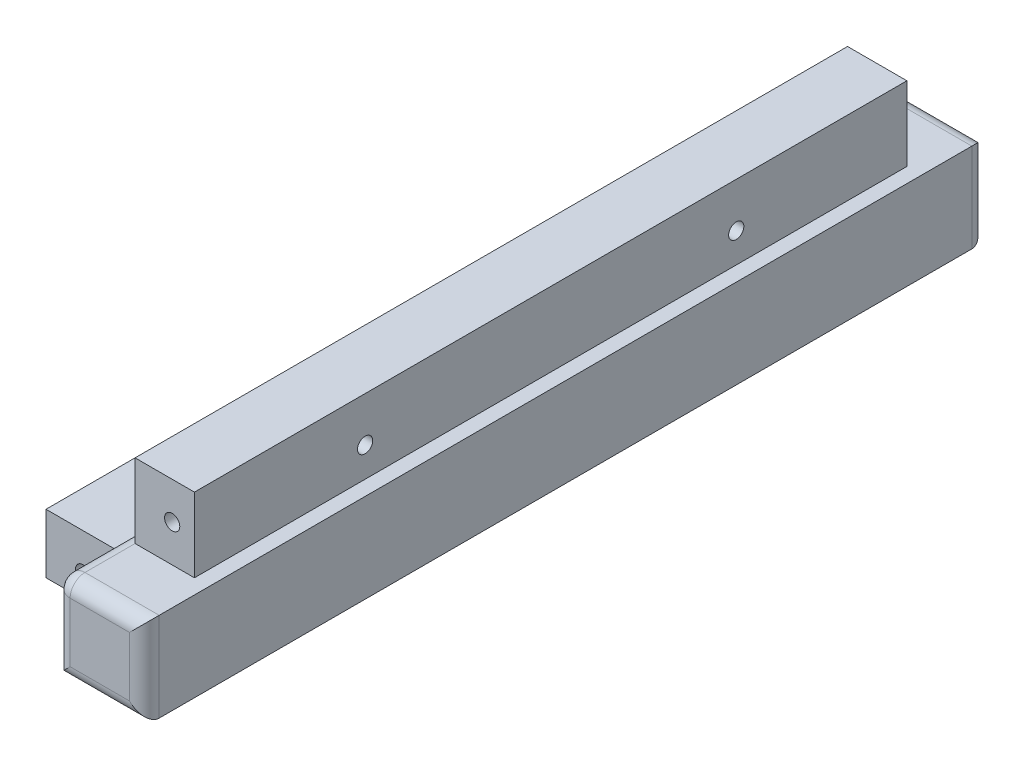
ISO-10303-21;
HEADER;
FILE_DESCRIPTION(('STEP AP214'),'2;1');
FILE_NAME('part.step','',(''),(''),'','','');
FILE_SCHEMA(('AUTOMOTIVE_DESIGN { 1 0 10303 214 1 1 1 1 }'));
ENDSEC;
DATA;
#1=APPLICATION_CONTEXT('core data for automotive mechanical design processes');
#2=APPLICATION_PROTOCOL_DEFINITION('international standard','automotive_design',2000,#1);
#3=PRODUCT_CONTEXT('',#1,'mechanical');
#4=PRODUCT('Part','Part','',(#3));
#5=PRODUCT_RELATED_PRODUCT_CATEGORY('part','',(#4));
#6=PRODUCT_DEFINITION_FORMATION('','',#4);
#7=PRODUCT_DEFINITION_CONTEXT('part definition',#1,'design');
#8=PRODUCT_DEFINITION('design','',#6,#7);
#9=PRODUCT_DEFINITION_SHAPE('','',#8);
#10=(LENGTH_UNIT() NAMED_UNIT(*) SI_UNIT(.MILLI.,.METRE.));
#11=(NAMED_UNIT(*) PLANE_ANGLE_UNIT() SI_UNIT($,.RADIAN.));
#12=(NAMED_UNIT(*) SI_UNIT($,.STERADIAN.) SOLID_ANGLE_UNIT());
#13=UNCERTAINTY_MEASURE_WITH_UNIT(LENGTH_MEASURE(1.E-05),#10,'distance_accuracy_value','');
#14=(GEOMETRIC_REPRESENTATION_CONTEXT(3) GLOBAL_UNCERTAINTY_ASSIGNED_CONTEXT((#13)) GLOBAL_UNIT_ASSIGNED_CONTEXT((#10,
#11,#12)) REPRESENTATION_CONTEXT('',''));
#15=CARTESIAN_POINT('',(0.,0.,0.));
#16=DIRECTION('',(0.,0.,1.));
#17=DIRECTION('',(1.,0.,0.));
#18=AXIS2_PLACEMENT_3D('',#15,#16,#17);
#19=CARTESIAN_POINT('',(-6.,6.,56.75));
#20=DIRECTION('',(0.,-1.,0.));
#21=DIRECTION('',(0.,0.,-1.));
#22=AXIS2_PLACEMENT_3D('',#19,#20,#21);
#23=PLANE('',#22);
#24=DIRECTION('',(1.,0.,0.));
#25=VECTOR('',#24,1.);
#26=CARTESIAN_POINT('',(4.,6.,48.));
#27=LINE('',#26,#25);
#28=CARTESIAN_POINT('',(-4.,6.,48.));
#29=VERTEX_POINT('',#28);
#30=CARTESIAN_POINT('',(4.,6.,48.));
#31=VERTEX_POINT('',#30);
#32=EDGE_CURVE('E280',#29,#31,#27,.T.);
#33=ORIENTED_EDGE('',*,*,#32,.F.);
#34=DIRECTION('',(0.,0.,-1.));
#35=VECTOR('',#34,1.);
#36=CARTESIAN_POINT('',(-4.,6.,56.75));
#37=LINE('',#36,#35);
#38=CARTESIAN_POINT('',(-4.,6.,54.75));
#39=VERTEX_POINT('',#38);
#40=EDGE_CURVE('E364',#29,#39,#37,.F.);
#41=ORIENTED_EDGE('',*,*,#40,.T.);
#42=DIRECTION('',(-1.,0.,0.));
#43=VECTOR('',#42,1.);
#44=CARTESIAN_POINT('',(6.,6.,54.75));
#45=LINE('',#44,#43);
#46=CARTESIAN_POINT('',(6.,6.,54.75));
#47=VERTEX_POINT('',#46);
#48=EDGE_CURVE('E368',#39,#47,#45,.F.);
#49=ORIENTED_EDGE('',*,*,#48,.T.);
#50=DIRECTION('',(0.,0.,-1.));
#51=VECTOR('',#50,1.);
#52=CARTESIAN_POINT('',(6.,6.,56.75));
#53=LINE('',#52,#51);
#54=CARTESIAN_POINT('',(6.,6.,-54.75));
#55=VERTEX_POINT('',#54);
#56=EDGE_CURVE('E360',#47,#55,#53,.T.);
#57=ORIENTED_EDGE('',*,*,#56,.T.);
#58=DIRECTION('',(-1.,0.,0.));
#59=VECTOR('',#58,1.);
#60=CARTESIAN_POINT('',(-6.,6.,-54.75));
#61=LINE('',#60,#59);
#62=CARTESIAN_POINT('',(-4.,6.,-54.75));
#63=VERTEX_POINT('',#62);
#64=EDGE_CURVE('E371',#55,#63,#61,.T.);
#65=ORIENTED_EDGE('',*,*,#64,.T.);
#66=CARTESIAN_POINT('',(-4.,6.,-48.));
#67=VERTEX_POINT('',#66);
#68=EDGE_CURVE('E365',#63,#67,#37,.F.);
#69=ORIENTED_EDGE('',*,*,#68,.T.);
#70=DIRECTION('',(-1.,0.,0.));
#71=VECTOR('',#70,1.);
#72=CARTESIAN_POINT('',(4.,6.,-48.));
#73=LINE('',#72,#71);
#74=CARTESIAN_POINT('',(4.,6.,-48.));
#75=VERTEX_POINT('',#74);
#76=EDGE_CURVE('E74',#75,#67,#73,.T.);
#77=ORIENTED_EDGE('',*,*,#76,.F.);
#78=DIRECTION('',(0.,0.,1.));
#79=VECTOR('',#78,1.);
#80=CARTESIAN_POINT('',(4.,6.,-69.5562484748662));
#81=LINE('',#80,#79);
#82=EDGE_CURVE('E69',#75,#31,#81,.T.);
#83=ORIENTED_EDGE('',*,*,#82,.T.);
#84=EDGE_LOOP('',(#33,#41,#49,#57,#65,#69,#77,#83));
#85=FACE_BOUND('',#84,.T.);
#86=ADVANCED_FACE('F51',(#85),#23,.F.);
#87=CARTESIAN_POINT('',(-6.,6.,56.75));
#88=DIRECTION('',(1.,0.,0.));
#89=DIRECTION('',(0.,1.,0.));
#90=AXIS2_PLACEMENT_3D('',#87,#88,#89);
#91=PLANE('',#90);
#92=DIRECTION('',(0.,1.,0.));
#93=VECTOR('',#92,1.);
#94=CARTESIAN_POINT('',(-6.,4.00000000000034,48.));
#95=LINE('',#94,#93);
#96=CARTESIAN_POINT('',(-6.,-3.99999999999965,48.));
#97=VERTEX_POINT('',#96);
#98=CARTESIAN_POINT('',(-6.,4.,48.));
#99=VERTEX_POINT('',#98);
#100=EDGE_CURVE('E285',#97,#99,#95,.T.);
#101=ORIENTED_EDGE('',*,*,#100,.F.);
#102=DIRECTION('',(0.,0.,1.));
#103=VECTOR('',#102,1.);
#104=CARTESIAN_POINT('',(-5.99999999999973,-3.99999999999965,-69.5562484748662));
#105=LINE('',#104,#103);
#106=CARTESIAN_POINT('',(-6.,-4.,-48.));
#107=VERTEX_POINT('',#106);
#108=EDGE_CURVE('E325',#107,#97,#105,.T.);
#109=ORIENTED_EDGE('',*,*,#108,.F.);
#110=DIRECTION('',(0.,-1.,0.));
#111=VECTOR('',#110,1.);
#112=CARTESIAN_POINT('',(-6.,4.00000000000034,-48.));
#113=LINE('',#112,#111);
#114=CARTESIAN_POINT('',(-6.,4.00000000000034,-48.));
#115=VERTEX_POINT('',#114);
#116=EDGE_CURVE('E314',#115,#107,#113,.T.);
#117=ORIENTED_EDGE('',*,*,#116,.F.);
#118=DIRECTION('',(0.,0.,-1.));
#119=VECTOR('',#118,1.);
#120=CARTESIAN_POINT('',(-6.,4.,56.75));
#121=LINE('',#120,#119);
#122=CARTESIAN_POINT('',(-6.,4.,-54.75));
#123=VERTEX_POINT('',#122);
#124=EDGE_CURVE('E388',#115,#123,#121,.T.);
#125=ORIENTED_EDGE('',*,*,#124,.T.);
#126=DIRECTION('',(0.,-1.,0.));
#127=VECTOR('',#126,1.);
#128=CARTESIAN_POINT('',(-6.,6.,-54.75));
#129=LINE('',#128,#127);
#130=CARTESIAN_POINT('',(-6.,-6.,-54.75));
#131=VERTEX_POINT('',#130);
#132=EDGE_CURVE('E396',#123,#131,#129,.T.);
#133=ORIENTED_EDGE('',*,*,#132,.T.);
#134=DIRECTION('',(0.,0.,-1.));
#135=VECTOR('',#134,1.);
#136=CARTESIAN_POINT('',(-6.,-6.,56.75));
#137=LINE('',#136,#135);
#138=CARTESIAN_POINT('',(-6.,-6.,54.75));
#139=VERTEX_POINT('',#138);
#140=EDGE_CURVE('E356',#139,#131,#137,.T.);
#141=ORIENTED_EDGE('',*,*,#140,.F.);
#142=DIRECTION('',(0.,-1.,0.));
#143=VECTOR('',#142,1.);
#144=CARTESIAN_POINT('',(-6.,6.,54.75));
#145=LINE('',#144,#143);
#146=CARTESIAN_POINT('',(-6.,4.,54.75));
#147=VERTEX_POINT('',#146);
#148=EDGE_CURVE('E393',#139,#147,#145,.F.);
#149=ORIENTED_EDGE('',*,*,#148,.T.);
#150=EDGE_CURVE('E389',#147,#99,#121,.T.);
#151=ORIENTED_EDGE('',*,*,#150,.T.);
#152=EDGE_LOOP('',(#101,#109,#117,#125,#133,#141,#149,#151));
#153=FACE_BOUND('',#152,.T.);
#154=ADVANCED_FACE('F490',(#153),#91,.F.);
#155=CARTESIAN_POINT('',(6.,6.,56.75));
#156=DIRECTION('',(-1.,0.,0.));
#157=DIRECTION('',(0.,-1.,0.));
#158=AXIS2_PLACEMENT_3D('',#155,#156,#157);
#159=PLANE('',#158);
#160=DIRECTION('',(0.,0.,-1.));
#161=VECTOR('',#160,1.);
#162=CARTESIAN_POINT('',(6.,-6.,56.75));
#163=LINE('',#162,#161);
#164=CARTESIAN_POINT('',(6.,-6.,54.75));
#165=VERTEX_POINT('',#164);
#166=CARTESIAN_POINT('',(6.,-6.,-54.75));
#167=VERTEX_POINT('',#166);
#168=EDGE_CURVE('E352',#165,#167,#163,.T.);
#169=ORIENTED_EDGE('',*,*,#168,.T.);
#170=DIRECTION('',(0.,1.,0.));
#171=VECTOR('',#170,1.);
#172=CARTESIAN_POINT('',(6.,6.,-54.75));
#173=LINE('',#172,#171);
#174=EDGE_CURVE('E408',#167,#55,#173,.T.);
#175=ORIENTED_EDGE('',*,*,#174,.T.);
#176=ORIENTED_EDGE('',*,*,#56,.F.);
#177=DIRECTION('',(0.,1.,0.));
#178=VECTOR('',#177,1.);
#179=CARTESIAN_POINT('',(6.,-6.,54.75));
#180=LINE('',#179,#178);
#181=EDGE_CURVE('E405',#47,#165,#180,.F.);
#182=ORIENTED_EDGE('',*,*,#181,.T.);
#183=EDGE_LOOP('',(#169,#175,#176,#182));
#184=FACE_BOUND('',#183,.T.);
#185=ADVANCED_FACE('F527',(#184),#159,.F.);
#186=CARTESIAN_POINT('',(-6.,-6.,56.75));
#187=DIRECTION('',(0.,1.,0.));
#188=DIRECTION('',(0.,0.,1.));
#189=AXIS2_PLACEMENT_3D('',#186,#187,#188);
#190=PLANE('',#189);
#191=ORIENTED_EDGE('',*,*,#140,.T.);
#192=DIRECTION('',(1.,0.,0.));
#193=VECTOR('',#192,1.);
#194=CARTESIAN_POINT('',(-6.,-6.,-54.75));
#195=LINE('',#194,#193);
#196=EDGE_CURVE('E402',#131,#167,#195,.T.);
#197=ORIENTED_EDGE('',*,*,#196,.T.);
#198=ORIENTED_EDGE('',*,*,#168,.F.);
#199=DIRECTION('',(1.,0.,0.));
#200=VECTOR('',#199,1.);
#201=CARTESIAN_POINT('',(-6.,-6.,54.75));
#202=LINE('',#201,#200);
#203=EDGE_CURVE('E399',#165,#139,#202,.F.);
#204=ORIENTED_EDGE('',*,*,#203,.T.);
#205=EDGE_LOOP('',(#191,#197,#198,#204));
#206=FACE_BOUND('',#205,.T.);
#207=ADVANCED_FACE('F533',(#206),#190,.F.);
#208=CARTESIAN_POINT('',(0.,0.,56.75));
#209=DIRECTION('',(0.,0.,1.));
#210=DIRECTION('',(1.,0.,0.));
#211=AXIS2_PLACEMENT_3D('',#208,#209,#210);
#212=PLANE('',#211);
#213=DIRECTION('',(0.,-1.,0.));
#214=VECTOR('',#213,1.);
#215=CARTESIAN_POINT('',(-4.,-6.,56.75));
#216=LINE('',#215,#214);
#217=CARTESIAN_POINT('',(-4.,4.,56.75));
#218=VERTEX_POINT('',#217);
#219=CARTESIAN_POINT('',(-4.,-4.,56.75));
#220=VERTEX_POINT('',#219);
#221=EDGE_CURVE('E61',#218,#220,#216,.T.);
#222=ORIENTED_EDGE('',*,*,#221,.T.);
#223=DIRECTION('',(1.,0.,0.));
#224=VECTOR('',#223,1.);
#225=CARTESIAN_POINT('',(6.,-4.,56.75));
#226=LINE('',#225,#224);
#227=CARTESIAN_POINT('',(4.,-4.,56.75));
#228=VERTEX_POINT('',#227);
#229=EDGE_CURVE('E12',#220,#228,#226,.T.);
#230=ORIENTED_EDGE('',*,*,#229,.T.);
#231=DIRECTION('',(0.,1.,0.));
#232=VECTOR('',#231,1.);
#233=CARTESIAN_POINT('',(4.,6.,56.75));
#234=LINE('',#233,#232);
#235=CARTESIAN_POINT('',(4.,4.,56.75));
#236=VERTEX_POINT('',#235);
#237=EDGE_CURVE('E411',#228,#236,#234,.T.);
#238=ORIENTED_EDGE('',*,*,#237,.T.);
#239=DIRECTION('',(-1.,0.,0.));
#240=VECTOR('',#239,1.);
#241=CARTESIAN_POINT('',(-6.,4.,56.75));
#242=LINE('',#241,#240);
#243=EDGE_CURVE('E414',#236,#218,#242,.T.);
#244=ORIENTED_EDGE('',*,*,#243,.T.);
#245=EDGE_LOOP('',(#222,#230,#238,#244));
#246=FACE_BOUND('',#245,.T.);
#247=ADVANCED_FACE('F473',(#246),#212,.T.);
#248=CARTESIAN_POINT('',(0.,0.,-56.75));
#249=DIRECTION('',(0.,0.,1.));
#250=DIRECTION('',(1.,0.,0.));
#251=AXIS2_PLACEMENT_3D('',#248,#249,#250);
#252=PLANE('',#251);
#253=DIRECTION('',(0.,-1.,0.));
#254=VECTOR('',#253,1.);
#255=CARTESIAN_POINT('',(-4.,0.,-56.75));
#256=LINE('',#255,#254);
#257=CARTESIAN_POINT('',(-4.,-4.,-56.75));
#258=VERTEX_POINT('',#257);
#259=CARTESIAN_POINT('',(-4.,4.,-56.75));
#260=VERTEX_POINT('',#259);
#261=EDGE_CURVE('E381',#258,#260,#256,.F.);
#262=ORIENTED_EDGE('',*,*,#261,.T.);
#263=DIRECTION('',(-1.,0.,0.));
#264=VECTOR('',#263,1.);
#265=CARTESIAN_POINT('',(0.,4.,-56.75));
#266=LINE('',#265,#264);
#267=CARTESIAN_POINT('',(4.,4.,-56.75));
#268=VERTEX_POINT('',#267);
#269=EDGE_CURVE('E384',#260,#268,#266,.F.);
#270=ORIENTED_EDGE('',*,*,#269,.T.);
#271=DIRECTION('',(0.,1.,0.));
#272=VECTOR('',#271,1.);
#273=CARTESIAN_POINT('',(4.,0.,-56.75));
#274=LINE('',#273,#272);
#275=CARTESIAN_POINT('',(4.,-4.,-56.75));
#276=VERTEX_POINT('',#275);
#277=EDGE_CURVE('E375',#268,#276,#274,.F.);
#278=ORIENTED_EDGE('',*,*,#277,.T.);
#279=DIRECTION('',(1.,0.,0.));
#280=VECTOR('',#279,1.);
#281=CARTESIAN_POINT('',(0.,-4.,-56.75));
#282=LINE('',#281,#280);
#283=EDGE_CURVE('E378',#276,#258,#282,.F.);
#284=ORIENTED_EDGE('',*,*,#283,.T.);
#285=EDGE_LOOP('',(#262,#270,#278,#284));
#286=FACE_BOUND('',#285,.T.);
#287=ADVANCED_FACE('F563',(#286),#252,.F.);
#288=CARTESIAN_POINT('',(4.,0.,54.75));
#289=DIRECTION('',(0.,-1.,0.));
#290=DIRECTION('',(1.,0.,0.));
#291=AXIS2_PLACEMENT_3D('',#288,#289,#290);
#292=CYLINDRICAL_SURFACE('',#291,2.);
#293=CARTESIAN_POINT('',(4.,4.,54.75));
#294=DIRECTION('',(0.707106781186547,-0.707106781186547,0.));
#295=DIRECTION('',(-0.707106781186547,-0.707106781186548,0.));
#296=AXIS2_PLACEMENT_3D('',#293,#294,#295);
#297=ELLIPSE('',#296,2.82842712474619,2.);
#298=EDGE_CURVE('E455',#236,#47,#297,.F.);
#299=ORIENTED_EDGE('',*,*,#298,.F.);
#300=ORIENTED_EDGE('',*,*,#237,.F.);
#301=CARTESIAN_POINT('',(4.,-4.,54.75));
#302=DIRECTION('',(-0.707106781186547,-0.707106781186548,0.));
#303=DIRECTION('',(0.707106781186547,-0.707106781186547,0.));
#304=AXIS2_PLACEMENT_3D('',#301,#302,#303);
#305=ELLIPSE('',#304,2.82842712474619,2.);
#306=EDGE_CURVE('E55',#165,#228,#305,.T.);
#307=ORIENTED_EDGE('',*,*,#306,.F.);
#308=ORIENTED_EDGE('',*,*,#181,.F.);
#309=EDGE_LOOP('',(#299,#300,#307,#308));
#310=FACE_BOUND('',#309,.T.);
#311=ADVANCED_FACE('F53',(#310),#292,.T.);
#312=CARTESIAN_POINT('',(0.,-4.,54.75));
#313=DIRECTION('',(-1.,0.,0.));
#314=DIRECTION('',(0.,0.,1.));
#315=AXIS2_PLACEMENT_3D('',#312,#313,#314);
#316=CYLINDRICAL_SURFACE('',#315,2.);
#317=ORIENTED_EDGE('',*,*,#306,.T.);
#318=ORIENTED_EDGE('',*,*,#229,.F.);
#319=CARTESIAN_POINT('',(-4.,-4.,54.75));
#320=DIRECTION('',(-0.707106781186548,0.707106781186547,0.));
#321=DIRECTION('',(0.707106781186547,0.707106781186548,0.));
#322=AXIS2_PLACEMENT_3D('',#319,#320,#321);
#323=ELLIPSE('',#322,2.82842712474619,2.);
#324=EDGE_CURVE('E452',#139,#220,#323,.T.);
#325=ORIENTED_EDGE('',*,*,#324,.F.);
#326=ORIENTED_EDGE('',*,*,#203,.F.);
#327=EDGE_LOOP('',(#317,#318,#325,#326));
#328=FACE_BOUND('',#327,.T.);
#329=ADVANCED_FACE('F468',(#328),#316,.T.);
#330=CARTESIAN_POINT('',(0.,4.,54.75));
#331=DIRECTION('',(1.,0.,0.));
#332=DIRECTION('',(0.,0.,-1.));
#333=AXIS2_PLACEMENT_3D('',#330,#331,#332);
#334=CYLINDRICAL_SURFACE('',#333,2.);
#335=ORIENTED_EDGE('',*,*,#298,.T.);
#336=ORIENTED_EDGE('',*,*,#48,.F.);
#337=CARTESIAN_POINT('',(-4.,4.,54.75));
#338=DIRECTION('',(-1.,0.,0.));
#339=DIRECTION('',(0.,0.,1.));
#340=AXIS2_PLACEMENT_3D('',#337,#338,#339);
#341=CIRCLE('',#340,2.);
#342=EDGE_CURVE('E448',#218,#39,#341,.T.);
#343=ORIENTED_EDGE('',*,*,#342,.F.);
#344=ORIENTED_EDGE('',*,*,#243,.F.);
#345=EDGE_LOOP('',(#335,#336,#343,#344));
#346=FACE_BOUND('',#345,.T.);
#347=ADVANCED_FACE('F481',(#346),#334,.T.);
#348=CARTESIAN_POINT('',(-4.,0.,54.75));
#349=DIRECTION('',(0.,1.,0.));
#350=DIRECTION('',(-1.,0.,0.));
#351=AXIS2_PLACEMENT_3D('',#348,#349,#350);
#352=CYLINDRICAL_SURFACE('',#351,2.);
#353=ORIENTED_EDGE('',*,*,#324,.T.);
#354=ORIENTED_EDGE('',*,*,#221,.F.);
#355=CARTESIAN_POINT('',(-4.,4.,54.75));
#356=DIRECTION('',(0.,1.,0.));
#357=DIRECTION('',(0.,0.,1.));
#358=AXIS2_PLACEMENT_3D('',#355,#356,#357);
#359=CIRCLE('',#358,2.);
#360=EDGE_CURVE('E444',#147,#218,#359,.T.);
#361=ORIENTED_EDGE('',*,*,#360,.F.);
#362=ORIENTED_EDGE('',*,*,#148,.F.);
#363=EDGE_LOOP('',(#353,#354,#361,#362));
#364=FACE_BOUND('',#363,.T.);
#365=ADVANCED_FACE('F478',(#364),#352,.T.);
#366=CARTESIAN_POINT('',(-4.,4.,54.75));
#367=DIRECTION('',(0.,0.,1.));
#368=DIRECTION('',(1.,0.,0.));
#369=AXIS2_PLACEMENT_3D('',#366,#367,#368);
#370=SPHERICAL_SURFACE('',#369,2.);
#371=ORIENTED_EDGE('',*,*,#360,.T.);
#372=ORIENTED_EDGE('',*,*,#342,.T.);
#373=CARTESIAN_POINT('',(-4.,4.,54.75));
#374=DIRECTION('',(0.,0.,1.));
#375=DIRECTION('',(1.,0.,0.));
#376=AXIS2_PLACEMENT_3D('',#373,#374,#375);
#377=CIRCLE('',#376,2.);
#378=EDGE_CURVE('E440',#147,#39,#377,.F.);
#379=ORIENTED_EDGE('',*,*,#378,.F.);
#380=EDGE_LOOP('',(#371,#372,#379));
#381=FACE_BOUND('',#380,.T.);
#382=ADVANCED_FACE('F483',(#381),#370,.T.);
#383=CARTESIAN_POINT('',(-6.,-4.,-54.75));
#384=DIRECTION('',(1.,0.,0.));
#385=DIRECTION('',(0.,0.,-1.));
#386=AXIS2_PLACEMENT_3D('',#383,#384,#385);
#387=CYLINDRICAL_SURFACE('',#386,2.);
#388=CARTESIAN_POINT('',(4.,-4.,-54.75));
#389=DIRECTION('',(0.707106781186547,0.707106781186548,0.));
#390=DIRECTION('',(-0.707106781186547,0.707106781186547,0.));
#391=AXIS2_PLACEMENT_3D('',#388,#389,#390);
#392=ELLIPSE('',#391,2.82842712474619,2.);
#393=EDGE_CURVE('E432',#167,#276,#392,.T.);
#394=ORIENTED_EDGE('',*,*,#393,.F.);
#395=ORIENTED_EDGE('',*,*,#196,.F.);
#396=CARTESIAN_POINT('',(-4.,-4.,-54.75));
#397=DIRECTION('',(0.707106781186548,-0.707106781186547,0.));
#398=DIRECTION('',(0.707106781186547,0.707106781186548,0.));
#399=AXIS2_PLACEMENT_3D('',#396,#397,#398);
#400=ELLIPSE('',#399,2.82842712474619,2.);
#401=EDGE_CURVE('E436',#258,#131,#400,.F.);
#402=ORIENTED_EDGE('',*,*,#401,.F.);
#403=ORIENTED_EDGE('',*,*,#283,.F.);
#404=EDGE_LOOP('',(#394,#395,#402,#403));
#405=FACE_BOUND('',#404,.T.);
#406=ADVANCED_FACE('F550',(#405),#387,.T.);
#407=CARTESIAN_POINT('',(-4.,4.,56.75));
#408=DIRECTION('',(0.,0.,-1.));
#409=DIRECTION('',(-1.,0.,0.));
#410=AXIS2_PLACEMENT_3D('',#407,#408,#409);
#411=CYLINDRICAL_SURFACE('',#410,2.);
#412=ORIENTED_EDGE('',*,*,#378,.T.);
#413=ORIENTED_EDGE('',*,*,#40,.F.);
#414=DIRECTION('',(0.,0.,1.));
#415=VECTOR('',#414,1.);
#416=CARTESIAN_POINT('',(-4.,6.,-69.5562484748662));
#417=LINE('',#416,#415);
#418=EDGE_CURVE('E274',#67,#29,#417,.T.);
#419=ORIENTED_EDGE('',*,*,#418,.F.);
#420=ORIENTED_EDGE('',*,*,#68,.F.);
#421=CARTESIAN_POINT('',(-4.,4.,-54.75));
#422=DIRECTION('',(0.,0.,-1.));
#423=DIRECTION('',(-1.,0.,0.));
#424=AXIS2_PLACEMENT_3D('',#421,#422,#423);
#425=CIRCLE('',#424,2.);
#426=EDGE_CURVE('E428',#123,#63,#425,.T.);
#427=ORIENTED_EDGE('',*,*,#426,.F.);
#428=ORIENTED_EDGE('',*,*,#124,.F.);
#429=DIRECTION('',(0.,0.,1.));
#430=VECTOR('',#429,1.);
#431=CARTESIAN_POINT('',(-6.,4.00000000000034,-69.5562484748662));
#432=LINE('',#431,#430);
#433=EDGE_CURVE('E315',#115,#99,#432,.T.);
#434=ORIENTED_EDGE('',*,*,#433,.T.);
#435=ORIENTED_EDGE('',*,*,#150,.F.);
#436=EDGE_LOOP('',(#412,#413,#419,#420,#427,#428,#434,#435));
#437=FACE_BOUND('',#436,.T.);
#438=ADVANCED_FACE('F486',(#437),#411,.T.);
#439=CARTESIAN_POINT('',(-4.,6.,-54.75));
#440=DIRECTION('',(0.,-1.,0.));
#441=DIRECTION('',(1.,0.,0.));
#442=AXIS2_PLACEMENT_3D('',#439,#440,#441);
#443=CYLINDRICAL_SURFACE('',#442,2.);
#444=ORIENTED_EDGE('',*,*,#401,.T.);
#445=ORIENTED_EDGE('',*,*,#132,.F.);
#446=CARTESIAN_POINT('',(-4.,4.,-54.75));
#447=DIRECTION('',(0.,1.,0.));
#448=DIRECTION('',(0.,0.,1.));
#449=AXIS2_PLACEMENT_3D('',#446,#447,#448);
#450=CIRCLE('',#449,2.);
#451=EDGE_CURVE('E424',#260,#123,#450,.T.);
#452=ORIENTED_EDGE('',*,*,#451,.F.);
#453=ORIENTED_EDGE('',*,*,#261,.F.);
#454=EDGE_LOOP('',(#444,#445,#452,#453));
#455=FACE_BOUND('',#454,.T.);
#456=ADVANCED_FACE('F544',(#455),#443,.T.);
#457=CARTESIAN_POINT('',(4.,6.,-54.75));
#458=DIRECTION('',(0.,1.,0.));
#459=DIRECTION('',(-1.,0.,0.));
#460=AXIS2_PLACEMENT_3D('',#457,#458,#459);
#461=CYLINDRICAL_SURFACE('',#460,2.);
#462=ORIENTED_EDGE('',*,*,#393,.T.);
#463=ORIENTED_EDGE('',*,*,#277,.F.);
#464=CARTESIAN_POINT('',(4.,4.,-54.75));
#465=DIRECTION('',(-0.707106781186547,0.707106781186547,0.));
#466=DIRECTION('',(0.707106781186547,0.707106781186548,0.));
#467=AXIS2_PLACEMENT_3D('',#464,#465,#466);
#468=ELLIPSE('',#467,2.82842712474619,2.);
#469=EDGE_CURVE('E421',#55,#268,#468,.T.);
#470=ORIENTED_EDGE('',*,*,#469,.F.);
#471=ORIENTED_EDGE('',*,*,#174,.F.);
#472=EDGE_LOOP('',(#462,#463,#470,#471));
#473=FACE_BOUND('',#472,.T.);
#474=ADVANCED_FACE('F540',(#473),#461,.T.);
#475=CARTESIAN_POINT('',(-4.,4.,-54.75));
#476=DIRECTION('',(-1.,0.,0.));
#477=DIRECTION('',(0.,0.,1.));
#478=AXIS2_PLACEMENT_3D('',#475,#476,#477);
#479=SPHERICAL_SURFACE('',#478,2.);
#480=ORIENTED_EDGE('',*,*,#451,.T.);
#481=ORIENTED_EDGE('',*,*,#426,.T.);
#482=CARTESIAN_POINT('',(-4.,4.,-54.75));
#483=DIRECTION('',(-1.,0.,0.));
#484=DIRECTION('',(0.,0.,1.));
#485=AXIS2_PLACEMENT_3D('',#482,#483,#484);
#486=CIRCLE('',#485,2.);
#487=EDGE_CURVE('E310',#260,#63,#486,.F.);
#488=ORIENTED_EDGE('',*,*,#487,.F.);
#489=EDGE_LOOP('',(#480,#481,#488));
#490=FACE_BOUND('',#489,.T.);
#491=ADVANCED_FACE('F536',(#490),#479,.T.);
#492=CARTESIAN_POINT('',(-6.,4.,-54.75));
#493=DIRECTION('',(-1.,0.,0.));
#494=DIRECTION('',(0.,0.,1.));
#495=AXIS2_PLACEMENT_3D('',#492,#493,#494);
#496=CYLINDRICAL_SURFACE('',#495,2.);
#497=ORIENTED_EDGE('',*,*,#469,.T.);
#498=ORIENTED_EDGE('',*,*,#269,.F.);
#499=ORIENTED_EDGE('',*,*,#487,.T.);
#500=ORIENTED_EDGE('',*,*,#64,.F.);
#501=EDGE_LOOP('',(#497,#498,#499,#500));
#502=FACE_BOUND('',#501,.T.);
#503=ADVANCED_FACE('F518',(#502),#496,.T.);
#504=CARTESIAN_POINT('',(-5.99999999999973,-3.99999999999965,-69.5562484748662));
#505=DIRECTION('',(0.,-1.,0.));
#506=DIRECTION('',(1.,0.,0.));
#507=AXIS2_PLACEMENT_3D('',#504,#505,#506);
#508=PLANE('',#507);
#509=CARTESIAN_POINT('',(-10.,-3.9999999999998,-25.));
#510=DIRECTION('',(0.,-1.,0.));
#511=DIRECTION('',(0.,0.,-1.));
#512=AXIS2_PLACEMENT_3D('',#509,#510,#511);
#513=CIRCLE('',#512,1.02499999999999);
#514=CARTESIAN_POINT('',(-10.,-3.9999999999998,-26.025));
#515=VERTEX_POINT('',#514);
#516=EDGE_CURVE('E208',#515,#515,#513,.T.);
#517=ORIENTED_EDGE('',*,*,#516,.F.);
#518=EDGE_LOOP('',(#517));
#519=FACE_BOUND('',#518,.T.);
#520=CARTESIAN_POINT('',(-10.,-3.9999999999998,25.));
#521=DIRECTION('',(0.,-1.,0.));
#522=DIRECTION('',(0.,0.,-1.));
#523=AXIS2_PLACEMENT_3D('',#520,#521,#522);
#524=CIRCLE('',#523,1.02499999999999);
#525=CARTESIAN_POINT('',(-10.,-3.9999999999998,23.975));
#526=VERTEX_POINT('',#525);
#527=EDGE_CURVE('E207',#526,#526,#524,.T.);
#528=ORIENTED_EDGE('',*,*,#527,.F.);
#529=EDGE_LOOP('',(#528));
#530=FACE_BOUND('',#529,.T.);
#531=DIRECTION('',(-1.,0.,0.));
#532=VECTOR('',#531,1.);
#533=CARTESIAN_POINT('',(-5.99999999999973,-3.99999999999965,-48.));
#534=LINE('',#533,#532);
#535=CARTESIAN_POINT('',(-15.9999999999997,-4.,-48.));
#536=VERTEX_POINT('',#535);
#537=EDGE_CURVE('E347',#107,#536,#534,.T.);
#538=ORIENTED_EDGE('',*,*,#537,.F.);
#539=ORIENTED_EDGE('',*,*,#108,.T.);
#540=DIRECTION('',(1.,0.,0.));
#541=VECTOR('',#540,1.);
#542=CARTESIAN_POINT('',(-5.99999999999973,-3.99999999999965,48.));
#543=LINE('',#542,#541);
#544=CARTESIAN_POINT('',(-15.9999999999997,-4.,48.));
#545=VERTEX_POINT('',#544);
#546=EDGE_CURVE('E318',#545,#97,#543,.T.);
#547=ORIENTED_EDGE('',*,*,#546,.F.);
#548=DIRECTION('',(0.,0.,1.));
#549=VECTOR('',#548,1.);
#550=CARTESIAN_POINT('',(-15.9999999999997,-4.,-69.5562484748662));
#551=LINE('',#550,#549);
#552=EDGE_CURVE('E322',#536,#545,#551,.T.);
#553=ORIENTED_EDGE('',*,*,#552,.F.);
#554=EDGE_LOOP('',(#538,#539,#547,#553));
#555=FACE_BOUND('',#554,.T.);
#556=ADVANCED_FACE('F503',(#519,#530,#555),#508,.T.);
#557=CARTESIAN_POINT('',(-16.,4.,-69.5562484748662));
#558=DIRECTION('',(-1.,0.,0.));
#559=DIRECTION('',(0.,-1.,0.));
#560=AXIS2_PLACEMENT_3D('',#557,#558,#559);
#561=PLANE('',#560);
#562=DIRECTION('',(0.,1.,0.));
#563=VECTOR('',#562,1.);
#564=CARTESIAN_POINT('',(-16.,4.,-48.));
#565=LINE('',#564,#563);
#566=CARTESIAN_POINT('',(-16.,4.,-48.));
#567=VERTEX_POINT('',#566);
#568=EDGE_CURVE('E329',#536,#567,#565,.T.);
#569=ORIENTED_EDGE('',*,*,#568,.F.);
#570=ORIENTED_EDGE('',*,*,#552,.T.);
#571=DIRECTION('',(0.,-1.,0.));
#572=VECTOR('',#571,1.);
#573=CARTESIAN_POINT('',(-16.,4.,48.));
#574=LINE('',#573,#572);
#575=CARTESIAN_POINT('',(-16.,4.,48.));
#576=VERTEX_POINT('',#575);
#577=EDGE_CURVE('E333',#576,#545,#574,.T.);
#578=ORIENTED_EDGE('',*,*,#577,.F.);
#579=DIRECTION('',(0.,0.,1.));
#580=VECTOR('',#579,1.);
#581=CARTESIAN_POINT('',(-16.,4.,-69.5562484748662));
#582=LINE('',#581,#580);
#583=EDGE_CURVE('E319',#567,#576,#582,.T.);
#584=ORIENTED_EDGE('',*,*,#583,.F.);
#585=EDGE_LOOP('',(#569,#570,#578,#584));
#586=FACE_BOUND('',#585,.T.);
#587=ADVANCED_FACE('F509',(#586),#561,.T.);
#588=CARTESIAN_POINT('',(-16.,4.,-69.5562484748662));
#589=DIRECTION('',(0.,1.,0.));
#590=DIRECTION('',(-1.,0.,0.));
#591=AXIS2_PLACEMENT_3D('',#588,#589,#590);
#592=PLANE('',#591);
#593=DIRECTION('',(1.,0.,0.));
#594=VECTOR('',#593,1.);
#595=CARTESIAN_POINT('',(-16.,4.,-48.));
#596=LINE('',#595,#594);
#597=EDGE_CURVE('E269',#567,#115,#596,.T.);
#598=ORIENTED_EDGE('',*,*,#597,.F.);
#599=ORIENTED_EDGE('',*,*,#583,.T.);
#600=DIRECTION('',(-1.,0.,0.));
#601=VECTOR('',#600,1.);
#602=CARTESIAN_POINT('',(-16.,4.,48.));
#603=LINE('',#602,#601);
#604=EDGE_CURVE('E337',#99,#576,#603,.T.);
#605=ORIENTED_EDGE('',*,*,#604,.F.);
#606=ORIENTED_EDGE('',*,*,#433,.F.);
#607=EDGE_LOOP('',(#598,#599,#605,#606));
#608=FACE_BOUND('',#607,.T.);
#609=ADVANCED_FACE('F494',(#608),#592,.T.);
#610=CARTESIAN_POINT('',(0.,0.,48.));
#611=DIRECTION('',(0.,0.,-1.));
#612=DIRECTION('',(-1.,0.,0.));
#613=AXIS2_PLACEMENT_3D('',#610,#611,#612);
#614=PLANE('',#613);
#615=CARTESIAN_POINT('',(-11.,-1.,48.));
#616=DIRECTION('',(0.,0.,1.));
#617=DIRECTION('',(1.,0.,0.));
#618=AXIS2_PLACEMENT_3D('',#615,#616,#617);
#619=CIRCLE('',#618,1.02499999999999);
#620=CARTESIAN_POINT('',(-9.97500000000001,-1.,48.));
#621=VERTEX_POINT('',#620);
#622=EDGE_CURVE('E253',#621,#621,#619,.T.);
#623=ORIENTED_EDGE('',*,*,#622,.F.);
#624=EDGE_LOOP('',(#623));
#625=FACE_BOUND('',#624,.T.);
#626=ORIENTED_EDGE('',*,*,#100,.T.);
#627=ORIENTED_EDGE('',*,*,#604,.T.);
#628=ORIENTED_EDGE('',*,*,#577,.T.);
#629=ORIENTED_EDGE('',*,*,#546,.T.);
#630=EDGE_LOOP('',(#626,#627,#628,#629));
#631=FACE_BOUND('',#630,.T.);
#632=ADVANCED_FACE('F498',(#625,#631),#614,.F.);
#633=CARTESIAN_POINT('',(0.,0.,-48.));
#634=DIRECTION('',(0.,0.,1.));
#635=DIRECTION('',(1.,0.,0.));
#636=AXIS2_PLACEMENT_3D('',#633,#634,#635);
#637=PLANE('',#636);
#638=CARTESIAN_POINT('',(-11.,-1.,-48.));
#639=DIRECTION('',(0.,0.,-1.));
#640=DIRECTION('',(-1.,0.,0.));
#641=AXIS2_PLACEMENT_3D('',#638,#639,#640);
#642=CIRCLE('',#641,1.02499999999999);
#643=CARTESIAN_POINT('',(-12.025,-1.,-48.));
#644=VERTEX_POINT('',#643);
#645=EDGE_CURVE('E237',#644,#644,#642,.T.);
#646=ORIENTED_EDGE('',*,*,#645,.F.);
#647=EDGE_LOOP('',(#646));
#648=FACE_BOUND('',#647,.T.);
#649=ORIENTED_EDGE('',*,*,#116,.T.);
#650=ORIENTED_EDGE('',*,*,#537,.T.);
#651=ORIENTED_EDGE('',*,*,#568,.T.);
#652=ORIENTED_EDGE('',*,*,#597,.T.);
#653=EDGE_LOOP('',(#649,#650,#651,#652));
#654=FACE_BOUND('',#653,.T.);
#655=ADVANCED_FACE('F506',(#648,#654),#637,.F.);
#656=CARTESIAN_POINT('',(-4.,6.,-69.5562484748662));
#657=DIRECTION('',(-1.,0.,0.));
#658=DIRECTION('',(0.,0.,1.));
#659=AXIS2_PLACEMENT_3D('',#656,#657,#658);
#660=PLANE('',#659);
#661=DIRECTION('',(0.,1.,0.));
#662=VECTOR('',#661,1.);
#663=CARTESIAN_POINT('',(-4.,6.,-48.));
#664=LINE('',#663,#662);
#665=CARTESIAN_POINT('',(-4.,16.,-48.));
#666=VERTEX_POINT('',#665);
#667=EDGE_CURVE('E273',#67,#666,#664,.T.);
#668=ORIENTED_EDGE('',*,*,#667,.F.);
#669=ORIENTED_EDGE('',*,*,#418,.T.);
#670=DIRECTION('',(0.,-1.,0.));
#671=VECTOR('',#670,1.);
#672=CARTESIAN_POINT('',(-4.,6.,48.));
#673=LINE('',#672,#671);
#674=CARTESIAN_POINT('',(-4.,16.,48.));
#675=VERTEX_POINT('',#674);
#676=EDGE_CURVE('E293',#675,#29,#673,.T.);
#677=ORIENTED_EDGE('',*,*,#676,.F.);
#678=DIRECTION('',(0.,0.,1.));
#679=VECTOR('',#678,1.);
#680=CARTESIAN_POINT('',(-4.,16.,-69.5562484748662));
#681=LINE('',#680,#679);
#682=EDGE_CURVE('E300',#666,#675,#681,.T.);
#683=ORIENTED_EDGE('',*,*,#682,.F.);
#684=EDGE_LOOP('',(#668,#669,#677,#683));
#685=FACE_BOUND('',#684,.T.);
#686=ADVANCED_FACE('F604',(#685),#660,.T.);
#687=CARTESIAN_POINT('',(-4.,16.,-69.5562484748662));
#688=DIRECTION('',(0.,1.,0.));
#689=DIRECTION('',(0.,0.,1.));
#690=AXIS2_PLACEMENT_3D('',#687,#688,#689);
#691=PLANE('',#690);
#692=DIRECTION('',(1.,0.,0.));
#693=VECTOR('',#692,1.);
#694=CARTESIAN_POINT('',(-4.,16.,-48.));
#695=LINE('',#694,#693);
#696=CARTESIAN_POINT('',(4.,16.,-48.));
#697=VERTEX_POINT('',#696);
#698=EDGE_CURVE('E270',#666,#697,#695,.T.);
#699=ORIENTED_EDGE('',*,*,#698,.F.);
#700=ORIENTED_EDGE('',*,*,#682,.T.);
#701=DIRECTION('',(-1.,0.,0.));
#702=VECTOR('',#701,1.);
#703=CARTESIAN_POINT('',(-4.,16.,48.));
#704=LINE('',#703,#702);
#705=CARTESIAN_POINT('',(4.,16.,48.));
#706=VERTEX_POINT('',#705);
#707=EDGE_CURVE('E289',#706,#675,#704,.T.);
#708=ORIENTED_EDGE('',*,*,#707,.F.);
#709=DIRECTION('',(0.,0.,1.));
#710=VECTOR('',#709,1.);
#711=CARTESIAN_POINT('',(4.,16.,-69.5562484748662));
#712=LINE('',#711,#710);
#713=EDGE_CURVE('E303',#697,#706,#712,.T.);
#714=ORIENTED_EDGE('',*,*,#713,.F.);
#715=EDGE_LOOP('',(#699,#700,#708,#714));
#716=FACE_BOUND('',#715,.T.);
#717=ADVANCED_FACE('F608',(#716),#691,.T.);
#718=CARTESIAN_POINT('',(4.,16.,-69.5562484748662));
#719=DIRECTION('',(1.,0.,0.));
#720=DIRECTION('',(0.,0.,-1.));
#721=AXIS2_PLACEMENT_3D('',#718,#719,#720);
#722=PLANE('',#721);
#723=CARTESIAN_POINT('',(4.,10.,25.));
#724=DIRECTION('',(1.,0.,0.));
#725=DIRECTION('',(0.,0.,-1.));
#726=AXIS2_PLACEMENT_3D('',#723,#724,#725);
#727=CIRCLE('',#726,1.025);
#728=CARTESIAN_POINT('',(4.,10.,23.975));
#729=VERTEX_POINT('',#728);
#730=EDGE_CURVE('E221',#729,#729,#727,.T.);
#731=ORIENTED_EDGE('',*,*,#730,.F.);
#732=EDGE_LOOP('',(#731));
#733=FACE_BOUND('',#732,.T.);
#734=CARTESIAN_POINT('',(4.,10.,-25.));
#735=DIRECTION('',(1.,0.,0.));
#736=DIRECTION('',(0.,0.,-1.));
#737=AXIS2_PLACEMENT_3D('',#734,#735,#736);
#738=CIRCLE('',#737,1.025);
#739=CARTESIAN_POINT('',(4.,10.,-26.025));
#740=VERTEX_POINT('',#739);
#741=EDGE_CURVE('E229',#740,#740,#738,.T.);
#742=ORIENTED_EDGE('',*,*,#741,.F.);
#743=EDGE_LOOP('',(#742));
#744=FACE_BOUND('',#743,.T.);
#745=DIRECTION('',(0.,-1.,0.));
#746=VECTOR('',#745,1.);
#747=CARTESIAN_POINT('',(4.,16.,-48.));
#748=LINE('',#747,#746);
#749=EDGE_CURVE('E279',#697,#75,#748,.T.);
#750=ORIENTED_EDGE('',*,*,#749,.F.);
#751=ORIENTED_EDGE('',*,*,#713,.T.);
#752=DIRECTION('',(0.,1.,0.));
#753=VECTOR('',#752,1.);
#754=CARTESIAN_POINT('',(4.,16.,48.));
#755=LINE('',#754,#753);
#756=EDGE_CURVE('E284',#31,#706,#755,.T.);
#757=ORIENTED_EDGE('',*,*,#756,.F.);
#758=ORIENTED_EDGE('',*,*,#82,.F.);
#759=EDGE_LOOP('',(#750,#751,#757,#758));
#760=FACE_BOUND('',#759,.T.);
#761=ADVANCED_FACE('F613',(#733,#744,#760),#722,.T.);
#762=CARTESIAN_POINT('',(0.,0.,48.));
#763=DIRECTION('',(0.,0.,-1.));
#764=DIRECTION('',(-1.,0.,0.));
#765=AXIS2_PLACEMENT_3D('',#762,#763,#764);
#766=PLANE('',#765);
#767=CARTESIAN_POINT('',(1.,11.,48.));
#768=DIRECTION('',(0.,0.,1.));
#769=DIRECTION('',(1.,0.,0.));
#770=AXIS2_PLACEMENT_3D('',#767,#768,#769);
#771=CIRCLE('',#770,1.02499999999999);
#772=CARTESIAN_POINT('',(2.02499999999999,11.,48.));
#773=VERTEX_POINT('',#772);
#774=EDGE_CURVE('E261',#773,#773,#771,.T.);
#775=ORIENTED_EDGE('',*,*,#774,.F.);
#776=EDGE_LOOP('',(#775));
#777=FACE_BOUND('',#776,.T.);
#778=ORIENTED_EDGE('',*,*,#32,.T.);
#779=ORIENTED_EDGE('',*,*,#756,.T.);
#780=ORIENTED_EDGE('',*,*,#707,.T.);
#781=ORIENTED_EDGE('',*,*,#676,.T.);
#782=EDGE_LOOP('',(#778,#779,#780,#781));
#783=FACE_BOUND('',#782,.T.);
#784=ADVANCED_FACE('F611',(#777,#783),#766,.F.);
#785=CARTESIAN_POINT('',(0.,0.,-48.));
#786=DIRECTION('',(0.,0.,1.));
#787=DIRECTION('',(1.,0.,0.));
#788=AXIS2_PLACEMENT_3D('',#785,#786,#787);
#789=PLANE('',#788);
#790=CARTESIAN_POINT('',(1.,11.,-48.));
#791=DIRECTION('',(0.,0.,-1.));
#792=DIRECTION('',(-1.,0.,0.));
#793=AXIS2_PLACEMENT_3D('',#790,#791,#792);
#794=CIRCLE('',#793,1.02499999999999);
#795=CARTESIAN_POINT('',(-0.0249999999999877,11.,-48.));
#796=VERTEX_POINT('',#795);
#797=EDGE_CURVE('E245',#796,#796,#794,.T.);
#798=ORIENTED_EDGE('',*,*,#797,.F.);
#799=EDGE_LOOP('',(#798));
#800=FACE_BOUND('',#799,.T.);
#801=ORIENTED_EDGE('',*,*,#76,.T.);
#802=ORIENTED_EDGE('',*,*,#667,.T.);
#803=ORIENTED_EDGE('',*,*,#698,.T.);
#804=ORIENTED_EDGE('',*,*,#749,.T.);
#805=EDGE_LOOP('',(#801,#802,#803,#804));
#806=FACE_BOUND('',#805,.T.);
#807=ADVANCED_FACE('F599',(#800,#806),#789,.F.);
#808=CARTESIAN_POINT('',(1.,11.,41.1158821345032));
#809=DIRECTION('',(0.,0.,1.));
#810=DIRECTION('',(1.,0.,0.));
#811=AXIS2_PLACEMENT_3D('',#808,#809,#810);
#812=CONICAL_SURFACE('',#811,1.025,1.02974425867665);
#813=CARTESIAN_POINT('',(1.,11.,40.5));
#814=VERTEX_POINT('',#813);
#815=VERTEX_LOOP('',#814);
#816=FACE_BOUND('',#815,.T.);
#817=CARTESIAN_POINT('',(1.,11.,41.1158821345032));
#818=DIRECTION('',(0.,0.,1.));
#819=DIRECTION('',(1.,0.,0.));
#820=AXIS2_PLACEMENT_3D('',#817,#818,#819);
#821=CIRCLE('',#820,1.025);
#822=CARTESIAN_POINT('',(2.025,11.,41.1158821345032));
#823=VERTEX_POINT('',#822);
#824=EDGE_CURVE('E265',#823,#823,#821,.T.);
#825=ORIENTED_EDGE('',*,*,#824,.T.);
#826=EDGE_LOOP('',(#825));
#827=FACE_BOUND('',#826,.T.);
#828=ADVANCED_FACE('F633',(#816,#827),#812,.F.);
#829=CARTESIAN_POINT('',(1.,11.,48.));
#830=DIRECTION('',(0.,0.,1.));
#831=DIRECTION('',(1.,0.,0.));
#832=AXIS2_PLACEMENT_3D('',#829,#830,#831);
#833=CYLINDRICAL_SURFACE('',#832,1.02499999999999);
#834=ORIENTED_EDGE('',*,*,#824,.F.);
#835=EDGE_LOOP('',(#834));
#836=FACE_BOUND('',#835,.T.);
#837=ORIENTED_EDGE('',*,*,#774,.T.);
#838=EDGE_LOOP('',(#837));
#839=FACE_BOUND('',#838,.T.);
#840=ADVANCED_FACE('F637',(#836,#839),#833,.F.);
#841=CARTESIAN_POINT('',(-11.,-1.,41.1158821345032));
#842=DIRECTION('',(0.,0.,1.));
#843=DIRECTION('',(1.,0.,0.));
#844=AXIS2_PLACEMENT_3D('',#841,#842,#843);
#845=CONICAL_SURFACE('',#844,1.025,1.02974425867665);
#846=CARTESIAN_POINT('',(-11.,-1.,40.5));
#847=VERTEX_POINT('',#846);
#848=VERTEX_LOOP('',#847);
#849=FACE_BOUND('',#848,.T.);
#850=CARTESIAN_POINT('',(-11.,-1.,41.1158821345032));
#851=DIRECTION('',(0.,0.,1.));
#852=DIRECTION('',(1.,0.,0.));
#853=AXIS2_PLACEMENT_3D('',#850,#851,#852);
#854=CIRCLE('',#853,1.025);
#855=CARTESIAN_POINT('',(-9.975,-1.,41.1158821345032));
#856=VERTEX_POINT('',#855);
#857=EDGE_CURVE('E257',#856,#856,#854,.T.);
#858=ORIENTED_EDGE('',*,*,#857,.T.);
#859=EDGE_LOOP('',(#858));
#860=FACE_BOUND('',#859,.T.);
#861=ADVANCED_FACE('F641',(#849,#860),#845,.F.);
#862=CARTESIAN_POINT('',(-11.,-1.,48.));
#863=DIRECTION('',(0.,0.,1.));
#864=DIRECTION('',(1.,0.,0.));
#865=AXIS2_PLACEMENT_3D('',#862,#863,#864);
#866=CYLINDRICAL_SURFACE('',#865,1.02499999999999);
#867=ORIENTED_EDGE('',*,*,#857,.F.);
#868=EDGE_LOOP('',(#867));
#869=FACE_BOUND('',#868,.T.);
#870=ORIENTED_EDGE('',*,*,#622,.T.);
#871=EDGE_LOOP('',(#870));
#872=FACE_BOUND('',#871,.T.);
#873=ADVANCED_FACE('F645',(#869,#872),#866,.F.);
#874=CARTESIAN_POINT('',(1.,11.,-41.1158821345032));
#875=DIRECTION('',(0.,0.,-1.));
#876=DIRECTION('',(-1.,0.,0.));
#877=AXIS2_PLACEMENT_3D('',#874,#875,#876);
#878=CONICAL_SURFACE('',#877,1.025,1.02974425867665);
#879=CARTESIAN_POINT('',(1.,11.,-40.5));
#880=VERTEX_POINT('',#879);
#881=VERTEX_LOOP('',#880);
#882=FACE_BOUND('',#881,.T.);
#883=CARTESIAN_POINT('',(1.,11.,-41.1158821345032));
#884=DIRECTION('',(0.,0.,-1.));
#885=DIRECTION('',(-1.,0.,0.));
#886=AXIS2_PLACEMENT_3D('',#883,#884,#885);
#887=CIRCLE('',#886,1.025);
#888=CARTESIAN_POINT('',(-0.0249999999999964,11.,-41.1158821345032));
#889=VERTEX_POINT('',#888);
#890=EDGE_CURVE('E249',#889,#889,#887,.T.);
#891=ORIENTED_EDGE('',*,*,#890,.T.);
#892=EDGE_LOOP('',(#891));
#893=FACE_BOUND('',#892,.T.);
#894=ADVANCED_FACE('F649',(#882,#893),#878,.F.);
#895=CARTESIAN_POINT('',(1.,11.,-48.));
#896=DIRECTION('',(0.,0.,-1.));
#897=DIRECTION('',(-1.,0.,0.));
#898=AXIS2_PLACEMENT_3D('',#895,#896,#897);
#899=CYLINDRICAL_SURFACE('',#898,1.02499999999999);
#900=ORIENTED_EDGE('',*,*,#890,.F.);
#901=EDGE_LOOP('',(#900));
#902=FACE_BOUND('',#901,.T.);
#903=ORIENTED_EDGE('',*,*,#797,.T.);
#904=EDGE_LOOP('',(#903));
#905=FACE_BOUND('',#904,.T.);
#906=ADVANCED_FACE('F653',(#902,#905),#899,.F.);
#907=CARTESIAN_POINT('',(-11.,-1.,-41.1158821345032));
#908=DIRECTION('',(0.,0.,-1.));
#909=DIRECTION('',(-1.,0.,0.));
#910=AXIS2_PLACEMENT_3D('',#907,#908,#909);
#911=CONICAL_SURFACE('',#910,1.025,1.02974425867665);
#912=CARTESIAN_POINT('',(-11.,-1.,-40.5));
#913=VERTEX_POINT('',#912);
#914=VERTEX_LOOP('',#913);
#915=FACE_BOUND('',#914,.T.);
#916=CARTESIAN_POINT('',(-11.,-1.,-41.1158821345032));
#917=DIRECTION('',(0.,0.,-1.));
#918=DIRECTION('',(-1.,0.,0.));
#919=AXIS2_PLACEMENT_3D('',#916,#917,#918);
#920=CIRCLE('',#919,1.025);
#921=CARTESIAN_POINT('',(-12.025,-1.,-41.1158821345032));
#922=VERTEX_POINT('',#921);
#923=EDGE_CURVE('E241',#922,#922,#920,.T.);
#924=ORIENTED_EDGE('',*,*,#923,.T.);
#925=EDGE_LOOP('',(#924));
#926=FACE_BOUND('',#925,.T.);
#927=ADVANCED_FACE('F657',(#915,#926),#911,.F.);
#928=CARTESIAN_POINT('',(-11.,-1.,-48.));
#929=DIRECTION('',(0.,0.,-1.));
#930=DIRECTION('',(-1.,0.,0.));
#931=AXIS2_PLACEMENT_3D('',#928,#929,#930);
#932=CYLINDRICAL_SURFACE('',#931,1.02499999999999);
#933=ORIENTED_EDGE('',*,*,#923,.F.);
#934=EDGE_LOOP('',(#933));
#935=FACE_BOUND('',#934,.T.);
#936=ORIENTED_EDGE('',*,*,#645,.T.);
#937=EDGE_LOOP('',(#936));
#938=FACE_BOUND('',#937,.T.);
#939=ADVANCED_FACE('F661',(#935,#938),#932,.F.);
#940=CARTESIAN_POINT('',(-2.88411786549675,10.,-25.));
#941=DIRECTION('',(1.,0.,0.));
#942=DIRECTION('',(0.,0.,-1.));
#943=AXIS2_PLACEMENT_3D('',#940,#941,#942);
#944=CONICAL_SURFACE('',#943,1.025,1.02974425867665);
#945=CARTESIAN_POINT('',(-3.5,10.,-25.));
#946=VERTEX_POINT('',#945);
#947=VERTEX_LOOP('',#946);
#948=FACE_BOUND('',#947,.T.);
#949=CARTESIAN_POINT('',(-2.88411786549675,10.,-25.));
#950=DIRECTION('',(1.,0.,0.));
#951=DIRECTION('',(0.,0.,-1.));
#952=AXIS2_PLACEMENT_3D('',#949,#950,#951);
#953=CIRCLE('',#952,1.025);
#954=CARTESIAN_POINT('',(-2.88411786549675,10.,-26.025));
#955=VERTEX_POINT('',#954);
#956=EDGE_CURVE('E233',#955,#955,#953,.T.);
#957=ORIENTED_EDGE('',*,*,#956,.T.);
#958=EDGE_LOOP('',(#957));
#959=FACE_BOUND('',#958,.T.);
#960=ADVANCED_FACE('F665',(#948,#959),#944,.F.);
#961=CARTESIAN_POINT('',(4.,10.,-25.));
#962=DIRECTION('',(1.,0.,0.));
#963=DIRECTION('',(0.,0.,-1.));
#964=AXIS2_PLACEMENT_3D('',#961,#962,#963);
#965=CYLINDRICAL_SURFACE('',#964,1.025);
#966=ORIENTED_EDGE('',*,*,#956,.F.);
#967=EDGE_LOOP('',(#966));
#968=FACE_BOUND('',#967,.T.);
#969=ORIENTED_EDGE('',*,*,#741,.T.);
#970=EDGE_LOOP('',(#969));
#971=FACE_BOUND('',#970,.T.);
#972=ADVANCED_FACE('F668',(#968,#971),#965,.F.);
#973=CARTESIAN_POINT('',(-2.88411786549675,10.,25.));
#974=DIRECTION('',(1.,0.,0.));
#975=DIRECTION('',(0.,0.,-1.));
#976=AXIS2_PLACEMENT_3D('',#973,#974,#975);
#977=CONICAL_SURFACE('',#976,1.025,1.02974425867665);
#978=CARTESIAN_POINT('',(-3.5,10.,25.));
#979=VERTEX_POINT('',#978);
#980=VERTEX_LOOP('',#979);
#981=FACE_BOUND('',#980,.T.);
#982=CARTESIAN_POINT('',(-2.88411786549675,10.,25.));
#983=DIRECTION('',(1.,0.,0.));
#984=DIRECTION('',(0.,0.,-1.));
#985=AXIS2_PLACEMENT_3D('',#982,#983,#984);
#986=CIRCLE('',#985,1.025);
#987=CARTESIAN_POINT('',(-2.88411786549675,10.,23.975));
#988=VERTEX_POINT('',#987);
#989=EDGE_CURVE('E225',#988,#988,#986,.T.);
#990=ORIENTED_EDGE('',*,*,#989,.T.);
#991=EDGE_LOOP('',(#990));
#992=FACE_BOUND('',#991,.T.);
#993=ADVANCED_FACE('F672',(#981,#992),#977,.F.);
#994=CARTESIAN_POINT('',(4.,10.,25.));
#995=DIRECTION('',(1.,0.,0.));
#996=DIRECTION('',(0.,0.,-1.));
#997=AXIS2_PLACEMENT_3D('',#994,#995,#996);
#998=CYLINDRICAL_SURFACE('',#997,1.025);
#999=ORIENTED_EDGE('',*,*,#989,.F.);
#1000=EDGE_LOOP('',(#999));
#1001=FACE_BOUND('',#1000,.T.);
#1002=ORIENTED_EDGE('',*,*,#730,.T.);
#1003=EDGE_LOOP('',(#1002));
#1004=FACE_BOUND('',#1003,.T.);
#1005=ADVANCED_FACE('F676',(#1001,#1004),#998,.F.);
#1006=CARTESIAN_POINT('',(-10.,2.88411786549696,25.));
#1007=DIRECTION('',(0.,-1.,0.));
#1008=DIRECTION('',(0.,0.,-1.));
#1009=AXIS2_PLACEMENT_3D('',#1006,#1007,#1008);
#1010=CONICAL_SURFACE('',#1009,1.025,1.02974425867665);
#1011=CARTESIAN_POINT('',(-10.,3.50000000000021,25.));
#1012=VERTEX_POINT('',#1011);
#1013=VERTEX_LOOP('',#1012);
#1014=FACE_BOUND('',#1013,.T.);
#1015=CARTESIAN_POINT('',(-10.,2.88411786549696,25.));
#1016=DIRECTION('',(0.,-1.,0.));
#1017=DIRECTION('',(0.,0.,-1.));
#1018=AXIS2_PLACEMENT_3D('',#1015,#1016,#1017);
#1019=CIRCLE('',#1018,1.025);
#1020=CARTESIAN_POINT('',(-10.,2.88411786549696,23.975));
#1021=VERTEX_POINT('',#1020);
#1022=EDGE_CURVE('E213',#1021,#1021,#1019,.T.);
#1023=ORIENTED_EDGE('',*,*,#1022,.T.);
#1024=EDGE_LOOP('',(#1023));
#1025=FACE_BOUND('',#1024,.T.);
#1026=ADVANCED_FACE('F680',(#1014,#1025),#1010,.F.);
#1027=CARTESIAN_POINT('',(-10.,-3.99999999999979,25.));
#1028=DIRECTION('',(0.,-1.,0.));
#1029=DIRECTION('',(0.,0.,-1.));
#1030=AXIS2_PLACEMENT_3D('',#1027,#1028,#1029);
#1031=CYLINDRICAL_SURFACE('',#1030,1.02499999999999);
#1032=ORIENTED_EDGE('',*,*,#1022,.F.);
#1033=EDGE_LOOP('',(#1032));
#1034=FACE_BOUND('',#1033,.T.);
#1035=ORIENTED_EDGE('',*,*,#527,.T.);
#1036=EDGE_LOOP('',(#1035));
#1037=FACE_BOUND('',#1036,.T.);
#1038=ADVANCED_FACE('F200',(#1034,#1037),#1031,.F.);
#1039=CARTESIAN_POINT('',(-10.,2.88411786549696,-25.));
#1040=DIRECTION('',(0.,-1.,0.));
#1041=DIRECTION('',(0.,0.,-1.));
#1042=AXIS2_PLACEMENT_3D('',#1039,#1040,#1041);
#1043=CONICAL_SURFACE('',#1042,1.025,1.02974425867665);
#1044=CARTESIAN_POINT('',(-10.,3.50000000000021,-25.));
#1045=VERTEX_POINT('',#1044);
#1046=VERTEX_LOOP('',#1045);
#1047=FACE_BOUND('',#1046,.T.);
#1048=CARTESIAN_POINT('',(-10.,2.88411786549696,-25.));
#1049=DIRECTION('',(0.,-1.,0.));
#1050=DIRECTION('',(0.,0.,-1.));
#1051=AXIS2_PLACEMENT_3D('',#1048,#1049,#1050);
#1052=CIRCLE('',#1051,1.025);
#1053=CARTESIAN_POINT('',(-10.,2.88411786549696,-26.025));
#1054=VERTEX_POINT('',#1053);
#1055=EDGE_CURVE('E204',#1054,#1054,#1052,.T.);
#1056=ORIENTED_EDGE('',*,*,#1055,.T.);
#1057=EDGE_LOOP('',(#1056));
#1058=FACE_BOUND('',#1057,.T.);
#1059=ADVANCED_FACE('F196',(#1047,#1058),#1043,.F.);
#1060=CARTESIAN_POINT('',(-10.,-3.99999999999979,-25.));
#1061=DIRECTION('',(0.,-1.,0.));
#1062=DIRECTION('',(0.,0.,-1.));
#1063=AXIS2_PLACEMENT_3D('',#1060,#1061,#1062);
#1064=CYLINDRICAL_SURFACE('',#1063,1.02499999999999);
#1065=ORIENTED_EDGE('',*,*,#1055,.F.);
#1066=EDGE_LOOP('',(#1065));
#1067=FACE_BOUND('',#1066,.T.);
#1068=ORIENTED_EDGE('',*,*,#516,.T.);
#1069=EDGE_LOOP('',(#1068));
#1070=FACE_BOUND('',#1069,.T.);
#1071=ADVANCED_FACE('F199',(#1067,#1070),#1064,.F.);
#1072=CLOSED_SHELL('',(#86,#154,#185,#207,#247,#287,#311,#329,#347,#365,#382,#406,#438,#456,
#474,#491,#503,#556,#587,#609,#632,#655,#686,#717,#761,#784,#807,#828,#840,#861,#873,#894,#906,
#927,#939,#960,#972,#993,#1005,#1026,#1038,#1059,#1071));
#1073=MANIFOLD_SOLID_BREP('B2',#1072);
#1074=ADVANCED_BREP_SHAPE_REPRESENTATION('',(#18,#1073),#14);
#1075=SHAPE_DEFINITION_REPRESENTATION(#9,#1074);
ENDSEC;
END-ISO-10303-21;
